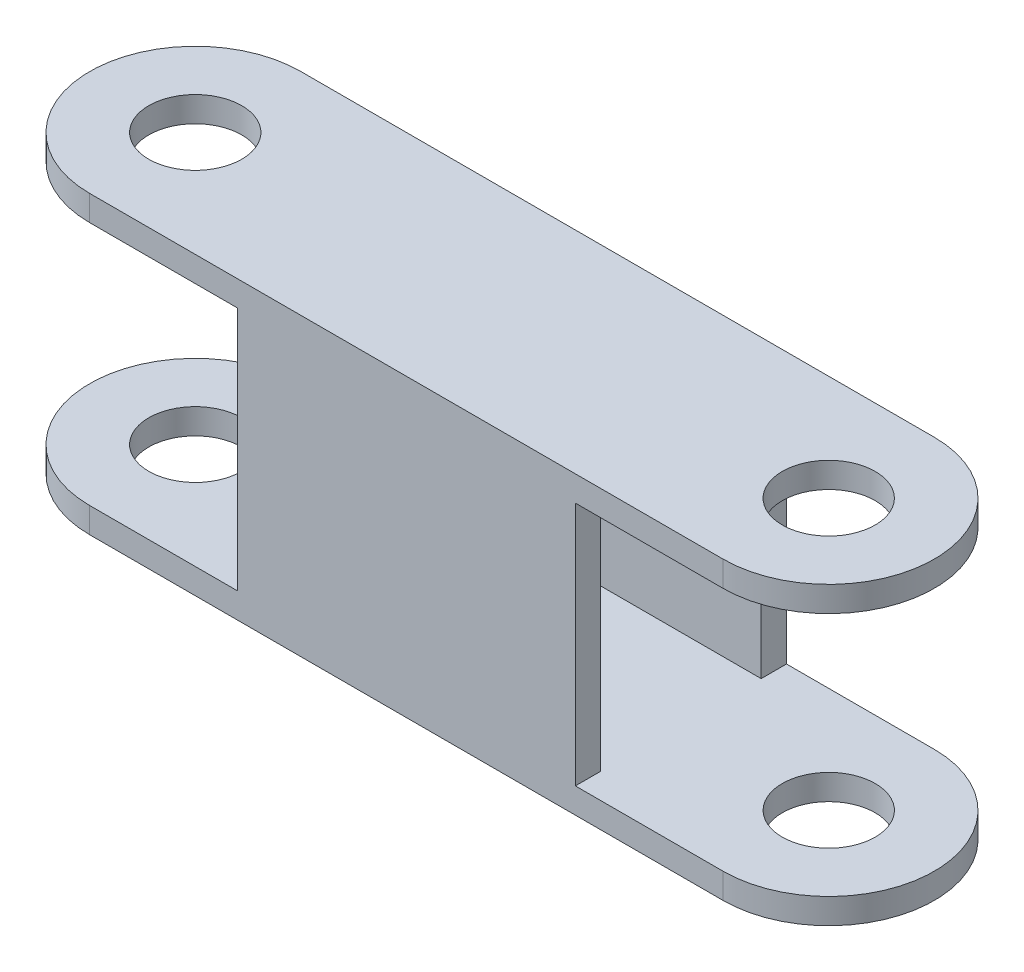
ISO-10303-21;
HEADER;
FILE_DESCRIPTION(('STEP AP214'),'2;1');
FILE_NAME('part.step','',(''),(''),'','','');
FILE_SCHEMA(('AUTOMOTIVE_DESIGN { 1 0 10303 214 1 1 1 1 }'));
ENDSEC;
DATA;
#1=APPLICATION_CONTEXT('core data for automotive mechanical design processes');
#2=APPLICATION_PROTOCOL_DEFINITION('international standard','automotive_design',2000,#1);
#3=PRODUCT_CONTEXT('',#1,'mechanical');
#4=PRODUCT('Part','Part','',(#3));
#5=PRODUCT_RELATED_PRODUCT_CATEGORY('part','',(#4));
#6=PRODUCT_DEFINITION_FORMATION('','',#4);
#7=PRODUCT_DEFINITION_CONTEXT('part definition',#1,'design');
#8=PRODUCT_DEFINITION('design','',#6,#7);
#9=PRODUCT_DEFINITION_SHAPE('','',#8);
#10=(LENGTH_UNIT() NAMED_UNIT(*) SI_UNIT(.MILLI.,.METRE.));
#11=(NAMED_UNIT(*) PLANE_ANGLE_UNIT() SI_UNIT($,.RADIAN.));
#12=(NAMED_UNIT(*) SI_UNIT($,.STERADIAN.) SOLID_ANGLE_UNIT());
#13=UNCERTAINTY_MEASURE_WITH_UNIT(LENGTH_MEASURE(1.E-05),#10,'distance_accuracy_value','');
#14=(GEOMETRIC_REPRESENTATION_CONTEXT(3) GLOBAL_UNCERTAINTY_ASSIGNED_CONTEXT((#13)) GLOBAL_UNIT_ASSIGNED_CONTEXT((#10,
#11,#12)) REPRESENTATION_CONTEXT('',''));
#15=CARTESIAN_POINT('',(0.,0.,0.));
#16=DIRECTION('',(0.,0.,1.));
#17=DIRECTION('',(1.,0.,0.));
#18=AXIS2_PLACEMENT_3D('',#15,#16,#17);
#19=CARTESIAN_POINT('',(40.,29.,-25.));
#20=DIRECTION('',(-1.,0.,0.));
#21=DIRECTION('',(0.,0.,1.));
#22=AXIS2_PLACEMENT_3D('',#19,#20,#21);
#23=PLANE('',#22);
#24=DIRECTION('',(0.,0.,1.));
#25=VECTOR('',#24,1.);
#26=CARTESIAN_POINT('',(40.,29.,-25.));
#27=LINE('',#26,#25);
#28=CARTESIAN_POINT('',(40.,29.,-25.));
#29=VERTEX_POINT('',#28);
#30=CARTESIAN_POINT('',(40.,29.,-19.));
#31=VERTEX_POINT('',#30);
#32=EDGE_CURVE('E208',#29,#31,#27,.T.);
#33=ORIENTED_EDGE('',*,*,#32,.T.);
#34=DIRECTION('',(0.,1.,0.));
#35=VECTOR('',#34,1.);
#36=CARTESIAN_POINT('',(40.,29.,-19.));
#37=LINE('',#36,#35);
#38=CARTESIAN_POINT('',(40.,-29.,-19.));
#39=VERTEX_POINT('',#38);
#40=EDGE_CURVE('E52',#39,#31,#37,.T.);
#41=ORIENTED_EDGE('',*,*,#40,.F.);
#42=DIRECTION('',(0.,0.,1.));
#43=VECTOR('',#42,1.);
#44=CARTESIAN_POINT('',(40.,-29.,-25.));
#45=LINE('',#44,#43);
#46=CARTESIAN_POINT('',(40.,-29.,-25.));
#47=VERTEX_POINT('',#46);
#48=EDGE_CURVE('E203',#47,#39,#45,.T.);
#49=ORIENTED_EDGE('',*,*,#48,.F.);
#50=DIRECTION('',(0.,-1.,0.));
#51=VECTOR('',#50,1.);
#52=CARTESIAN_POINT('',(40.,29.,-25.));
#53=LINE('',#52,#51);
#54=EDGE_CURVE('E196',#29,#47,#53,.T.);
#55=ORIENTED_EDGE('',*,*,#54,.F.);
#56=EDGE_LOOP('',(#33,#41,#49,#55));
#57=FACE_BOUND('',#56,.T.);
#58=ADVANCED_FACE('F35',(#57),#23,.F.);
#59=CARTESIAN_POINT('',(-40.,29.,-25.));
#60=DIRECTION('',(-1.,0.,0.));
#61=DIRECTION('',(0.,0.,1.));
#62=AXIS2_PLACEMENT_3D('',#59,#60,#61);
#63=PLANE('',#62);
#64=DIRECTION('',(0.,1.,0.));
#65=VECTOR('',#64,1.);
#66=CARTESIAN_POINT('',(-40.,29.,-19.));
#67=LINE('',#66,#65);
#68=CARTESIAN_POINT('',(-40.,-29.,-19.));
#69=VERTEX_POINT('',#68);
#70=CARTESIAN_POINT('',(-40.,29.,-19.));
#71=VERTEX_POINT('',#70);
#72=EDGE_CURVE('E150',#69,#71,#67,.T.);
#73=ORIENTED_EDGE('',*,*,#72,.T.);
#74=DIRECTION('',(0.,0.,1.));
#75=VECTOR('',#74,1.);
#76=CARTESIAN_POINT('',(-40.,29.,-25.));
#77=LINE('',#76,#75);
#78=CARTESIAN_POINT('',(-40.,29.,-25.));
#79=VERTEX_POINT('',#78);
#80=EDGE_CURVE('E162',#79,#71,#77,.T.);
#81=ORIENTED_EDGE('',*,*,#80,.F.);
#82=DIRECTION('',(0.,-1.,0.));
#83=VECTOR('',#82,1.);
#84=CARTESIAN_POINT('',(-40.,29.,-25.));
#85=LINE('',#84,#83);
#86=CARTESIAN_POINT('',(-40.,-29.,-25.));
#87=VERTEX_POINT('',#86);
#88=EDGE_CURVE('E346',#79,#87,#85,.T.);
#89=ORIENTED_EDGE('',*,*,#88,.T.);
#90=DIRECTION('',(0.,0.,1.));
#91=VECTOR('',#90,1.);
#92=CARTESIAN_POINT('',(-40.,-29.,-25.));
#93=LINE('',#92,#91);
#94=EDGE_CURVE('E164',#87,#69,#93,.T.);
#95=ORIENTED_EDGE('',*,*,#94,.T.);
#96=EDGE_LOOP('',(#73,#81,#89,#95));
#97=FACE_BOUND('',#96,.T.);
#98=ADVANCED_FACE('F160',(#97),#63,.T.);
#99=CARTESIAN_POINT('',(-75.,35.,0.));
#100=DIRECTION('',(0.,-1.,0.));
#101=DIRECTION('',(0.,0.,-1.));
#102=AXIS2_PLACEMENT_3D('',#99,#100,#101);
#103=CYLINDRICAL_SURFACE('',#102,25.);
#104=CARTESIAN_POINT('',(-75.,29.,0.));
#105=DIRECTION('',(0.,-1.,0.));
#106=DIRECTION('',(1.,0.,0.));
#107=AXIS2_PLACEMENT_3D('',#104,#105,#106);
#108=CIRCLE('',#107,25.);
#109=CARTESIAN_POINT('',(-75.,29.,25.));
#110=VERTEX_POINT('',#109);
#111=CARTESIAN_POINT('',(-75.,29.,-25.));
#112=VERTEX_POINT('',#111);
#113=EDGE_CURVE('E183',#110,#112,#108,.T.);
#114=ORIENTED_EDGE('',*,*,#113,.F.);
#115=DIRECTION('',(0.,-1.,0.));
#116=VECTOR('',#115,1.);
#117=CARTESIAN_POINT('',(-75.,35.,25.));
#118=LINE('',#117,#116);
#119=CARTESIAN_POINT('',(-75.,35.,25.));
#120=VERTEX_POINT('',#119);
#121=EDGE_CURVE('E11',#120,#110,#118,.T.);
#122=ORIENTED_EDGE('',*,*,#121,.F.);
#123=CARTESIAN_POINT('',(-75.,35.,0.));
#124=DIRECTION('',(0.,1.,0.));
#125=DIRECTION('',(0.,0.,1.));
#126=AXIS2_PLACEMENT_3D('',#123,#124,#125);
#127=CIRCLE('',#126,25.);
#128=CARTESIAN_POINT('',(-75.,35.,-25.));
#129=VERTEX_POINT('',#128);
#130=EDGE_CURVE('E228',#129,#120,#127,.T.);
#131=ORIENTED_EDGE('',*,*,#130,.F.);
#132=DIRECTION('',(0.,-1.,0.));
#133=VECTOR('',#132,1.);
#134=CARTESIAN_POINT('',(-75.,35.,-25.));
#135=LINE('',#134,#133);
#136=EDGE_CURVE('E249',#129,#112,#135,.T.);
#137=ORIENTED_EDGE('',*,*,#136,.T.);
#138=EDGE_LOOP('',(#114,#122,#131,#137));
#139=FACE_BOUND('',#138,.T.);
#140=ADVANCED_FACE('F37',(#139),#103,.T.);
#141=CARTESIAN_POINT('',(-75.,-29.,0.));
#142=DIRECTION('',(0.,1.,0.));
#143=DIRECTION('',(-1.,0.,0.));
#144=AXIS2_PLACEMENT_3D('',#141,#142,#143);
#145=CIRCLE('',#144,25.);
#146=CARTESIAN_POINT('',(-75.,-29.,-25.));
#147=VERTEX_POINT('',#146);
#148=CARTESIAN_POINT('',(-75.,-29.,25.));
#149=VERTEX_POINT('',#148);
#150=EDGE_CURVE('E176',#147,#149,#145,.T.);
#151=ORIENTED_EDGE('',*,*,#150,.F.);
#152=CARTESIAN_POINT('',(-75.,-35.,-25.));
#153=VERTEX_POINT('',#152);
#154=EDGE_CURVE('E238',#147,#153,#135,.T.);
#155=ORIENTED_EDGE('',*,*,#154,.T.);
#156=CARTESIAN_POINT('',(-75.,-35.,0.));
#157=DIRECTION('',(0.,1.,0.));
#158=DIRECTION('',(0.,0.,1.));
#159=AXIS2_PLACEMENT_3D('',#156,#157,#158);
#160=CIRCLE('',#159,25.);
#161=CARTESIAN_POINT('',(-75.,-35.,25.));
#162=VERTEX_POINT('',#161);
#163=EDGE_CURVE('E225',#153,#162,#160,.T.);
#164=ORIENTED_EDGE('',*,*,#163,.T.);
#165=EDGE_CURVE('E44',#149,#162,#118,.T.);
#166=ORIENTED_EDGE('',*,*,#165,.F.);
#167=EDGE_LOOP('',(#151,#155,#164,#166));
#168=FACE_BOUND('',#167,.T.);
#169=ADVANCED_FACE('F376',(#168),#103,.T.);
#170=CARTESIAN_POINT('',(-75.,35.,25.));
#171=DIRECTION('',(0.,0.,-1.));
#172=DIRECTION('',(-1.,0.,0.));
#173=AXIS2_PLACEMENT_3D('',#170,#171,#172);
#174=PLANE('',#173);
#175=DIRECTION('',(1.,0.,0.));
#176=VECTOR('',#175,1.);
#177=CARTESIAN_POINT('',(-100.,29.,25.));
#178=LINE('',#177,#176);
#179=CARTESIAN_POINT('',(-40.,29.,25.));
#180=VERTEX_POINT('',#179);
#181=EDGE_CURVE('E341',#110,#180,#178,.T.);
#182=ORIENTED_EDGE('',*,*,#181,.T.);
#183=DIRECTION('',(0.,-1.,0.));
#184=VECTOR('',#183,1.);
#185=CARTESIAN_POINT('',(-40.,29.,25.));
#186=LINE('',#185,#184);
#187=CARTESIAN_POINT('',(-40.,-29.,25.));
#188=VERTEX_POINT('',#187);
#189=EDGE_CURVE('E338',#180,#188,#186,.T.);
#190=ORIENTED_EDGE('',*,*,#189,.T.);
#191=DIRECTION('',(-1.,0.,0.));
#192=VECTOR('',#191,1.);
#193=CARTESIAN_POINT('',(-40.,-29.,25.));
#194=LINE('',#193,#192);
#195=EDGE_CURVE('E333',#188,#149,#194,.T.);
#196=ORIENTED_EDGE('',*,*,#195,.T.);
#197=ORIENTED_EDGE('',*,*,#165,.T.);
#198=DIRECTION('',(1.,0.,0.));
#199=VECTOR('',#198,1.);
#200=CARTESIAN_POINT('',(-75.,-35.,25.));
#201=LINE('',#200,#199);
#202=CARTESIAN_POINT('',(75.,-35.,25.));
#203=VERTEX_POINT('',#202);
#204=EDGE_CURVE('E241',#162,#203,#201,.T.);
#205=ORIENTED_EDGE('',*,*,#204,.T.);
#206=DIRECTION('',(0.,-1.,0.));
#207=VECTOR('',#206,1.);
#208=CARTESIAN_POINT('',(75.,35.,25.));
#209=LINE('',#208,#207);
#210=CARTESIAN_POINT('',(75.,-29.,25.));
#211=VERTEX_POINT('',#210);
#212=EDGE_CURVE('E256',#211,#203,#209,.T.);
#213=ORIENTED_EDGE('',*,*,#212,.F.);
#214=DIRECTION('',(1.,0.,0.));
#215=VECTOR('',#214,1.);
#216=CARTESIAN_POINT('',(40.,-29.,25.));
#217=LINE('',#216,#215);
#218=CARTESIAN_POINT('',(40.,-29.,25.));
#219=VERTEX_POINT('',#218);
#220=EDGE_CURVE('E190',#219,#211,#217,.T.);
#221=ORIENTED_EDGE('',*,*,#220,.F.);
#222=DIRECTION('',(0.,-1.,0.));
#223=VECTOR('',#222,1.);
#224=CARTESIAN_POINT('',(40.,29.,25.));
#225=LINE('',#224,#223);
#226=CARTESIAN_POINT('',(40.,29.,25.));
#227=VERTEX_POINT('',#226);
#228=EDGE_CURVE('E187',#227,#219,#225,.T.);
#229=ORIENTED_EDGE('',*,*,#228,.F.);
#230=DIRECTION('',(-1.,0.,0.));
#231=VECTOR('',#230,1.);
#232=CARTESIAN_POINT('',(100.,29.,25.));
#233=LINE('',#232,#231);
#234=CARTESIAN_POINT('',(75.,29.,25.));
#235=VERTEX_POINT('',#234);
#236=EDGE_CURVE('E185',#235,#227,#233,.T.);
#237=ORIENTED_EDGE('',*,*,#236,.F.);
#238=CARTESIAN_POINT('',(75.,35.,25.));
#239=VERTEX_POINT('',#238);
#240=EDGE_CURVE('E257',#239,#235,#209,.T.);
#241=ORIENTED_EDGE('',*,*,#240,.F.);
#242=DIRECTION('',(1.,0.,0.));
#243=VECTOR('',#242,1.);
#244=CARTESIAN_POINT('',(-75.,35.,25.));
#245=LINE('',#244,#243);
#246=EDGE_CURVE('E231',#120,#239,#245,.T.);
#247=ORIENTED_EDGE('',*,*,#246,.F.);
#248=ORIENTED_EDGE('',*,*,#121,.T.);
#249=EDGE_LOOP('',(#182,#190,#196,#197,#205,#213,#221,#229,#237,#241,#247,#248));
#250=FACE_BOUND('',#249,.T.);
#251=ADVANCED_FACE('F352',(#250),#174,.F.);
#252=CARTESIAN_POINT('',(-75.,35.,-25.));
#253=DIRECTION('',(0.,0.,1.));
#254=DIRECTION('',(1.,0.,0.));
#255=AXIS2_PLACEMENT_3D('',#252,#253,#254);
#256=PLANE('',#255);
#257=DIRECTION('',(1.,0.,0.));
#258=VECTOR('',#257,1.);
#259=CARTESIAN_POINT('',(-100.,29.,-25.));
#260=LINE('',#259,#258);
#261=EDGE_CURVE('E171',#112,#79,#260,.T.);
#262=ORIENTED_EDGE('',*,*,#261,.F.);
#263=ORIENTED_EDGE('',*,*,#136,.F.);
#264=DIRECTION('',(-1.,0.,0.));
#265=VECTOR('',#264,1.);
#266=CARTESIAN_POINT('',(-75.,35.,-25.));
#267=LINE('',#266,#265);
#268=CARTESIAN_POINT('',(75.,35.,-25.));
#269=VERTEX_POINT('',#268);
#270=EDGE_CURVE('E236',#269,#129,#267,.T.);
#271=ORIENTED_EDGE('',*,*,#270,.F.);
#272=DIRECTION('',(0.,-1.,0.));
#273=VECTOR('',#272,1.);
#274=CARTESIAN_POINT('',(75.,35.,-25.));
#275=LINE('',#274,#273);
#276=CARTESIAN_POINT('',(75.,29.,-25.));
#277=VERTEX_POINT('',#276);
#278=EDGE_CURVE('E253',#269,#277,#275,.T.);
#279=ORIENTED_EDGE('',*,*,#278,.T.);
#280=DIRECTION('',(-1.,0.,0.));
#281=VECTOR('',#280,1.);
#282=CARTESIAN_POINT('',(100.,29.,-25.));
#283=LINE('',#282,#281);
#284=EDGE_CURVE('E193',#277,#29,#283,.T.);
#285=ORIENTED_EDGE('',*,*,#284,.T.);
#286=ORIENTED_EDGE('',*,*,#54,.T.);
#287=DIRECTION('',(1.,0.,0.));
#288=VECTOR('',#287,1.);
#289=CARTESIAN_POINT('',(40.,-29.,-25.));
#290=LINE('',#289,#288);
#291=CARTESIAN_POINT('',(75.,-29.,-25.));
#292=VERTEX_POINT('',#291);
#293=EDGE_CURVE('E199',#47,#292,#290,.T.);
#294=ORIENTED_EDGE('',*,*,#293,.T.);
#295=CARTESIAN_POINT('',(75.,-35.,-25.));
#296=VERTEX_POINT('',#295);
#297=EDGE_CURVE('E252',#292,#296,#275,.T.);
#298=ORIENTED_EDGE('',*,*,#297,.T.);
#299=DIRECTION('',(-1.,0.,0.));
#300=VECTOR('',#299,1.);
#301=CARTESIAN_POINT('',(-75.,-35.,-25.));
#302=LINE('',#301,#300);
#303=EDGE_CURVE('E232',#296,#153,#302,.T.);
#304=ORIENTED_EDGE('',*,*,#303,.T.);
#305=ORIENTED_EDGE('',*,*,#154,.F.);
#306=DIRECTION('',(-1.,0.,0.));
#307=VECTOR('',#306,1.);
#308=CARTESIAN_POINT('',(-40.,-29.,-25.));
#309=LINE('',#308,#307);
#310=EDGE_CURVE('E344',#87,#147,#309,.T.);
#311=ORIENTED_EDGE('',*,*,#310,.F.);
#312=ORIENTED_EDGE('',*,*,#88,.F.);
#313=EDGE_LOOP('',(#262,#263,#271,#279,#285,#286,#294,#298,#304,#305,#311,#312));
#314=FACE_BOUND('',#313,.T.);
#315=ADVANCED_FACE('F360',(#314),#256,.F.);
#316=CARTESIAN_POINT('',(-75.,35.,0.));
#317=DIRECTION('',(0.,-1.,0.));
#318=DIRECTION('',(0.,0.,-1.));
#319=AXIS2_PLACEMENT_3D('',#316,#317,#318);
#320=CYLINDRICAL_SURFACE('',#319,11.);
#321=CARTESIAN_POINT('',(-75.,35.,0.));
#322=DIRECTION('',(0.,1.,0.));
#323=DIRECTION('',(0.,0.,1.));
#324=AXIS2_PLACEMENT_3D('',#321,#322,#323);
#325=CIRCLE('',#324,11.);
#326=CARTESIAN_POINT('',(-75.,35.,11.));
#327=VERTEX_POINT('',#326);
#328=EDGE_CURVE('E216',#327,#327,#325,.T.);
#329=ORIENTED_EDGE('',*,*,#328,.T.);
#330=EDGE_LOOP('',(#329));
#331=FACE_BOUND('',#330,.T.);
#332=CARTESIAN_POINT('',(-75.,29.,0.));
#333=DIRECTION('',(0.,-1.,0.));
#334=DIRECTION('',(1.,0.,0.));
#335=AXIS2_PLACEMENT_3D('',#332,#333,#334);
#336=CIRCLE('',#335,11.);
#337=CARTESIAN_POINT('',(-64.,29.,0.));
#338=VERTEX_POINT('',#337);
#339=EDGE_CURVE('E39',#338,#338,#336,.T.);
#340=ORIENTED_EDGE('',*,*,#339,.T.);
#341=EDGE_LOOP('',(#340));
#342=FACE_BOUND('',#341,.T.);
#343=ADVANCED_FACE('F288',(#331,#342),#320,.F.);
#344=CARTESIAN_POINT('',(-75.,-35.,0.));
#345=DIRECTION('',(0.,1.,0.));
#346=DIRECTION('',(0.,0.,1.));
#347=AXIS2_PLACEMENT_3D('',#344,#345,#346);
#348=CIRCLE('',#347,11.);
#349=CARTESIAN_POINT('',(-75.,-35.,11.));
#350=VERTEX_POINT('',#349);
#351=EDGE_CURVE('E215',#350,#350,#348,.T.);
#352=ORIENTED_EDGE('',*,*,#351,.F.);
#353=EDGE_LOOP('',(#352));
#354=FACE_BOUND('',#353,.T.);
#355=CARTESIAN_POINT('',(-75.,-29.,0.));
#356=DIRECTION('',(0.,1.,0.));
#357=DIRECTION('',(-1.,0.,0.));
#358=AXIS2_PLACEMENT_3D('',#355,#356,#357);
#359=CIRCLE('',#358,11.);
#360=CARTESIAN_POINT('',(-86.,-29.,0.));
#361=VERTEX_POINT('',#360);
#362=EDGE_CURVE('E172',#361,#361,#359,.T.);
#363=ORIENTED_EDGE('',*,*,#362,.T.);
#364=EDGE_LOOP('',(#363));
#365=FACE_BOUND('',#364,.T.);
#366=ADVANCED_FACE('F285',(#354,#365),#320,.F.);
#367=CARTESIAN_POINT('',(75.,35.,0.));
#368=DIRECTION('',(0.,-1.,0.));
#369=DIRECTION('',(0.,0.,-1.));
#370=AXIS2_PLACEMENT_3D('',#367,#368,#369);
#371=CYLINDRICAL_SURFACE('',#370,25.);
#372=CARTESIAN_POINT('',(75.,-29.,0.));
#373=DIRECTION('',(0.,-1.,0.));
#374=DIRECTION('',(1.,0.,0.));
#375=AXIS2_PLACEMENT_3D('',#372,#373,#374);
#376=CIRCLE('',#375,25.);
#377=EDGE_CURVE('E213',#292,#211,#376,.T.);
#378=ORIENTED_EDGE('',*,*,#377,.T.);
#379=ORIENTED_EDGE('',*,*,#212,.T.);
#380=CARTESIAN_POINT('',(75.,-35.,0.));
#381=DIRECTION('',(0.,1.,0.));
#382=DIRECTION('',(0.,0.,1.));
#383=AXIS2_PLACEMENT_3D('',#380,#381,#382);
#384=CIRCLE('',#383,25.);
#385=EDGE_CURVE('E244',#203,#296,#384,.T.);
#386=ORIENTED_EDGE('',*,*,#385,.T.);
#387=ORIENTED_EDGE('',*,*,#297,.F.);
#388=EDGE_LOOP('',(#378,#379,#386,#387));
#389=FACE_BOUND('',#388,.T.);
#390=ADVANCED_FACE('F272',(#389),#371,.T.);
#391=CARTESIAN_POINT('',(75.,35.,0.));
#392=DIRECTION('',(0.,-1.,0.));
#393=DIRECTION('',(0.,0.,-1.));
#394=AXIS2_PLACEMENT_3D('',#391,#392,#393);
#395=CYLINDRICAL_SURFACE('',#394,11.);
#396=CARTESIAN_POINT('',(75.,-29.,0.));
#397=DIRECTION('',(0.,-1.,0.));
#398=DIRECTION('',(1.,0.,0.));
#399=AXIS2_PLACEMENT_3D('',#396,#397,#398);
#400=CIRCLE('',#399,11.);
#401=CARTESIAN_POINT('',(86.,-29.,0.));
#402=VERTEX_POINT('',#401);
#403=EDGE_CURVE('E212',#402,#402,#400,.T.);
#404=ORIENTED_EDGE('',*,*,#403,.F.);
#405=EDGE_LOOP('',(#404));
#406=FACE_BOUND('',#405,.T.);
#407=CARTESIAN_POINT('',(75.,-35.,0.));
#408=DIRECTION('',(0.,1.,0.));
#409=DIRECTION('',(0.,0.,1.));
#410=AXIS2_PLACEMENT_3D('',#407,#408,#409);
#411=CIRCLE('',#410,11.);
#412=CARTESIAN_POINT('',(75.,-35.,11.));
#413=VERTEX_POINT('',#412);
#414=EDGE_CURVE('E219',#413,#413,#411,.T.);
#415=ORIENTED_EDGE('',*,*,#414,.F.);
#416=EDGE_LOOP('',(#415));
#417=FACE_BOUND('',#416,.T.);
#418=ADVANCED_FACE('F268',(#406,#417),#395,.F.);
#419=CARTESIAN_POINT('',(-75.,35.,0.));
#420=DIRECTION('',(0.,1.,0.));
#421=DIRECTION('',(0.,0.,1.));
#422=AXIS2_PLACEMENT_3D('',#419,#420,#421);
#423=PLANE('',#422);
#424=CARTESIAN_POINT('',(75.,35.,0.));
#425=DIRECTION('',(0.,1.,0.));
#426=DIRECTION('',(0.,0.,1.));
#427=AXIS2_PLACEMENT_3D('',#424,#425,#426);
#428=CIRCLE('',#427,11.);
#429=CARTESIAN_POINT('',(75.,35.,11.));
#430=VERTEX_POINT('',#429);
#431=EDGE_CURVE('E222',#430,#430,#428,.T.);
#432=ORIENTED_EDGE('',*,*,#431,.F.);
#433=EDGE_LOOP('',(#432));
#434=FACE_BOUND('',#433,.T.);
#435=ORIENTED_EDGE('',*,*,#130,.T.);
#436=ORIENTED_EDGE('',*,*,#246,.T.);
#437=CARTESIAN_POINT('',(75.,35.,0.));
#438=DIRECTION('',(0.,1.,0.));
#439=DIRECTION('',(0.,0.,1.));
#440=AXIS2_PLACEMENT_3D('',#437,#438,#439);
#441=CIRCLE('',#440,25.);
#442=EDGE_CURVE('E234',#239,#269,#441,.T.);
#443=ORIENTED_EDGE('',*,*,#442,.T.);
#444=ORIENTED_EDGE('',*,*,#270,.T.);
#445=EDGE_LOOP('',(#435,#436,#443,#444));
#446=FACE_BOUND('',#445,.T.);
#447=ORIENTED_EDGE('',*,*,#328,.F.);
#448=EDGE_LOOP('',(#447));
#449=FACE_BOUND('',#448,.T.);
#450=ADVANCED_FACE('F271',(#434,#446,#449),#423,.T.);
#451=CARTESIAN_POINT('',(-75.,-35.,0.));
#452=DIRECTION('',(0.,1.,0.));
#453=DIRECTION('',(0.,0.,1.));
#454=AXIS2_PLACEMENT_3D('',#451,#452,#453);
#455=PLANE('',#454);
#456=ORIENTED_EDGE('',*,*,#163,.F.);
#457=ORIENTED_EDGE('',*,*,#303,.F.);
#458=ORIENTED_EDGE('',*,*,#385,.F.);
#459=ORIENTED_EDGE('',*,*,#204,.F.);
#460=EDGE_LOOP('',(#456,#457,#458,#459));
#461=FACE_BOUND('',#460,.T.);
#462=ORIENTED_EDGE('',*,*,#414,.T.);
#463=EDGE_LOOP('',(#462));
#464=FACE_BOUND('',#463,.T.);
#465=ORIENTED_EDGE('',*,*,#351,.T.);
#466=EDGE_LOOP('',(#465));
#467=FACE_BOUND('',#466,.T.);
#468=ADVANCED_FACE('F277',(#461,#464,#467),#455,.F.);
#469=ORIENTED_EDGE('',*,*,#240,.T.);
#470=CARTESIAN_POINT('',(75.,29.,0.));
#471=DIRECTION('',(0.,1.,0.));
#472=DIRECTION('',(-1.,0.,0.));
#473=AXIS2_PLACEMENT_3D('',#470,#471,#472);
#474=CIRCLE('',#473,25.);
#475=EDGE_CURVE('E210',#235,#277,#474,.T.);
#476=ORIENTED_EDGE('',*,*,#475,.T.);
#477=ORIENTED_EDGE('',*,*,#278,.F.);
#478=ORIENTED_EDGE('',*,*,#442,.F.);
#479=EDGE_LOOP('',(#469,#476,#477,#478));
#480=FACE_BOUND('',#479,.T.);
#481=ADVANCED_FACE('F280',(#480),#371,.T.);
#482=CARTESIAN_POINT('',(75.,29.,0.));
#483=DIRECTION('',(0.,1.,0.));
#484=DIRECTION('',(-1.,0.,0.));
#485=AXIS2_PLACEMENT_3D('',#482,#483,#484);
#486=CIRCLE('',#485,11.);
#487=CARTESIAN_POINT('',(64.,29.,0.));
#488=VERTEX_POINT('',#487);
#489=EDGE_CURVE('E206',#488,#488,#486,.T.);
#490=ORIENTED_EDGE('',*,*,#489,.F.);
#491=EDGE_LOOP('',(#490));
#492=FACE_BOUND('',#491,.T.);
#493=ORIENTED_EDGE('',*,*,#431,.T.);
#494=EDGE_LOOP('',(#493));
#495=FACE_BOUND('',#494,.T.);
#496=ADVANCED_FACE('F274',(#492,#495),#395,.F.);
#497=CARTESIAN_POINT('',(40.,-29.,-25.));
#498=DIRECTION('',(0.,-1.,0.));
#499=DIRECTION('',(1.,0.,0.));
#500=AXIS2_PLACEMENT_3D('',#497,#498,#499);
#501=PLANE('',#500);
#502=ORIENTED_EDGE('',*,*,#403,.T.);
#503=EDGE_LOOP('',(#502));
#504=FACE_BOUND('',#503,.T.);
#505=ORIENTED_EDGE('',*,*,#377,.F.);
#506=ORIENTED_EDGE('',*,*,#293,.F.);
#507=ORIENTED_EDGE('',*,*,#48,.T.);
#508=DIRECTION('',(1.,0.,0.));
#509=VECTOR('',#508,1.);
#510=CARTESIAN_POINT('',(-100.001,-29.,-19.));
#511=LINE('',#510,#509);
#512=EDGE_CURVE('E327',#69,#39,#511,.T.);
#513=ORIENTED_EDGE('',*,*,#512,.F.);
#514=ORIENTED_EDGE('',*,*,#94,.F.);
#515=ORIENTED_EDGE('',*,*,#310,.T.);
#516=ORIENTED_EDGE('',*,*,#150,.T.);
#517=ORIENTED_EDGE('',*,*,#195,.F.);
#518=CARTESIAN_POINT('',(-40.,-29.,19.));
#519=VERTEX_POINT('',#518);
#520=EDGE_CURVE('E181',#519,#188,#93,.T.);
#521=ORIENTED_EDGE('',*,*,#520,.F.);
#522=DIRECTION('',(1.,0.,0.));
#523=VECTOR('',#522,1.);
#524=CARTESIAN_POINT('',(-100.001,-29.,19.));
#525=LINE('',#524,#523);
#526=CARTESIAN_POINT('',(40.,-29.,19.));
#527=VERTEX_POINT('',#526);
#528=EDGE_CURVE('E323',#519,#527,#525,.T.);
#529=ORIENTED_EDGE('',*,*,#528,.T.);
#530=EDGE_CURVE('E207',#527,#219,#45,.T.);
#531=ORIENTED_EDGE('',*,*,#530,.T.);
#532=ORIENTED_EDGE('',*,*,#220,.T.);
#533=EDGE_LOOP('',(#505,#506,#507,#513,#514,#515,#516,#517,#521,#529,#531,#532));
#534=FACE_BOUND('',#533,.T.);
#535=ORIENTED_EDGE('',*,*,#362,.F.);
#536=EDGE_LOOP('',(#535));
#537=FACE_BOUND('',#536,.T.);
#538=ADVANCED_FACE('F265',(#504,#534,#537),#501,.F.);
#539=CARTESIAN_POINT('',(100.,29.,-25.));
#540=DIRECTION('',(0.,1.,0.));
#541=DIRECTION('',(-1.,0.,0.));
#542=AXIS2_PLACEMENT_3D('',#539,#540,#541);
#543=PLANE('',#542);
#544=ORIENTED_EDGE('',*,*,#489,.T.);
#545=EDGE_LOOP('',(#544));
#546=FACE_BOUND('',#545,.T.);
#547=ORIENTED_EDGE('',*,*,#236,.T.);
#548=CARTESIAN_POINT('',(40.,29.,19.));
#549=VERTEX_POINT('',#548);
#550=EDGE_CURVE('E202',#549,#227,#27,.T.);
#551=ORIENTED_EDGE('',*,*,#550,.F.);
#552=DIRECTION('',(1.,0.,0.));
#553=VECTOR('',#552,1.);
#554=CARTESIAN_POINT('',(-100.001,29.,19.));
#555=LINE('',#554,#553);
#556=CARTESIAN_POINT('',(-40.,29.,19.));
#557=VERTEX_POINT('',#556);
#558=EDGE_CURVE('E60',#557,#549,#555,.T.);
#559=ORIENTED_EDGE('',*,*,#558,.F.);
#560=EDGE_CURVE('E173',#557,#180,#77,.T.);
#561=ORIENTED_EDGE('',*,*,#560,.T.);
#562=ORIENTED_EDGE('',*,*,#181,.F.);
#563=ORIENTED_EDGE('',*,*,#113,.T.);
#564=ORIENTED_EDGE('',*,*,#261,.T.);
#565=ORIENTED_EDGE('',*,*,#80,.T.);
#566=DIRECTION('',(1.,0.,0.));
#567=VECTOR('',#566,1.);
#568=CARTESIAN_POINT('',(-100.001,29.,-19.));
#569=LINE('',#568,#567);
#570=EDGE_CURVE('E147',#71,#31,#569,.T.);
#571=ORIENTED_EDGE('',*,*,#570,.T.);
#572=ORIENTED_EDGE('',*,*,#32,.F.);
#573=ORIENTED_EDGE('',*,*,#284,.F.);
#574=ORIENTED_EDGE('',*,*,#475,.F.);
#575=EDGE_LOOP('',(#547,#551,#559,#561,#562,#563,#564,#565,#571,#572,#573,#574));
#576=FACE_BOUND('',#575,.T.);
#577=ORIENTED_EDGE('',*,*,#339,.F.);
#578=EDGE_LOOP('',(#577));
#579=FACE_BOUND('',#578,.T.);
#580=ADVANCED_FACE('F168',(#546,#576,#579),#543,.F.);
#581=ORIENTED_EDGE('',*,*,#530,.F.);
#582=DIRECTION('',(0.,-1.,0.));
#583=VECTOR('',#582,1.);
#584=CARTESIAN_POINT('',(40.,29.,19.));
#585=LINE('',#584,#583);
#586=EDGE_CURVE('E155',#549,#527,#585,.T.);
#587=ORIENTED_EDGE('',*,*,#586,.F.);
#588=ORIENTED_EDGE('',*,*,#550,.T.);
#589=ORIENTED_EDGE('',*,*,#228,.T.);
#590=EDGE_LOOP('',(#581,#587,#588,#589));
#591=FACE_BOUND('',#590,.T.);
#592=ADVANCED_FACE('F298',(#591),#23,.F.);
#593=DIRECTION('',(0.,-1.,0.));
#594=VECTOR('',#593,1.);
#595=CARTESIAN_POINT('',(-40.,29.,19.));
#596=LINE('',#595,#594);
#597=EDGE_CURVE('E165',#557,#519,#596,.T.);
#598=ORIENTED_EDGE('',*,*,#597,.T.);
#599=ORIENTED_EDGE('',*,*,#520,.T.);
#600=ORIENTED_EDGE('',*,*,#189,.F.);
#601=ORIENTED_EDGE('',*,*,#560,.F.);
#602=EDGE_LOOP('',(#598,#599,#600,#601));
#603=FACE_BOUND('',#602,.T.);
#604=ADVANCED_FACE('F309',(#603),#63,.T.);
#605=CARTESIAN_POINT('',(-100.001,29.,-19.));
#606=DIRECTION('',(0.,0.,-1.));
#607=DIRECTION('',(-1.,0.,0.));
#608=AXIS2_PLACEMENT_3D('',#605,#606,#607);
#609=PLANE('',#608);
#610=ORIENTED_EDGE('',*,*,#512,.T.);
#611=ORIENTED_EDGE('',*,*,#40,.T.);
#612=ORIENTED_EDGE('',*,*,#570,.F.);
#613=ORIENTED_EDGE('',*,*,#72,.F.);
#614=EDGE_LOOP('',(#610,#611,#612,#613));
#615=FACE_BOUND('',#614,.T.);
#616=ADVANCED_FACE('F149',(#615),#609,.F.);
#617=CARTESIAN_POINT('',(-100.001,29.,19.));
#618=DIRECTION('',(0.,0.,1.));
#619=DIRECTION('',(1.,0.,0.));
#620=AXIS2_PLACEMENT_3D('',#617,#618,#619);
#621=PLANE('',#620);
#622=ORIENTED_EDGE('',*,*,#558,.T.);
#623=ORIENTED_EDGE('',*,*,#586,.T.);
#624=ORIENTED_EDGE('',*,*,#528,.F.);
#625=ORIENTED_EDGE('',*,*,#597,.F.);
#626=EDGE_LOOP('',(#622,#623,#624,#625));
#627=FACE_BOUND('',#626,.T.);
#628=ADVANCED_FACE('F329',(#627),#621,.F.);
#629=CLOSED_SHELL('',(#58,#98,#140,#169,#251,#315,#343,#366,#390,#418,#450,#468,#481,#496,#538,
#580,#592,#604,#616,#628));
#630=MANIFOLD_SOLID_BREP('B2',#629);
#631=ADVANCED_BREP_SHAPE_REPRESENTATION('',(#18,#630),#14);
#632=SHAPE_DEFINITION_REPRESENTATION(#9,#631);
ENDSEC;
END-ISO-10303-21;
